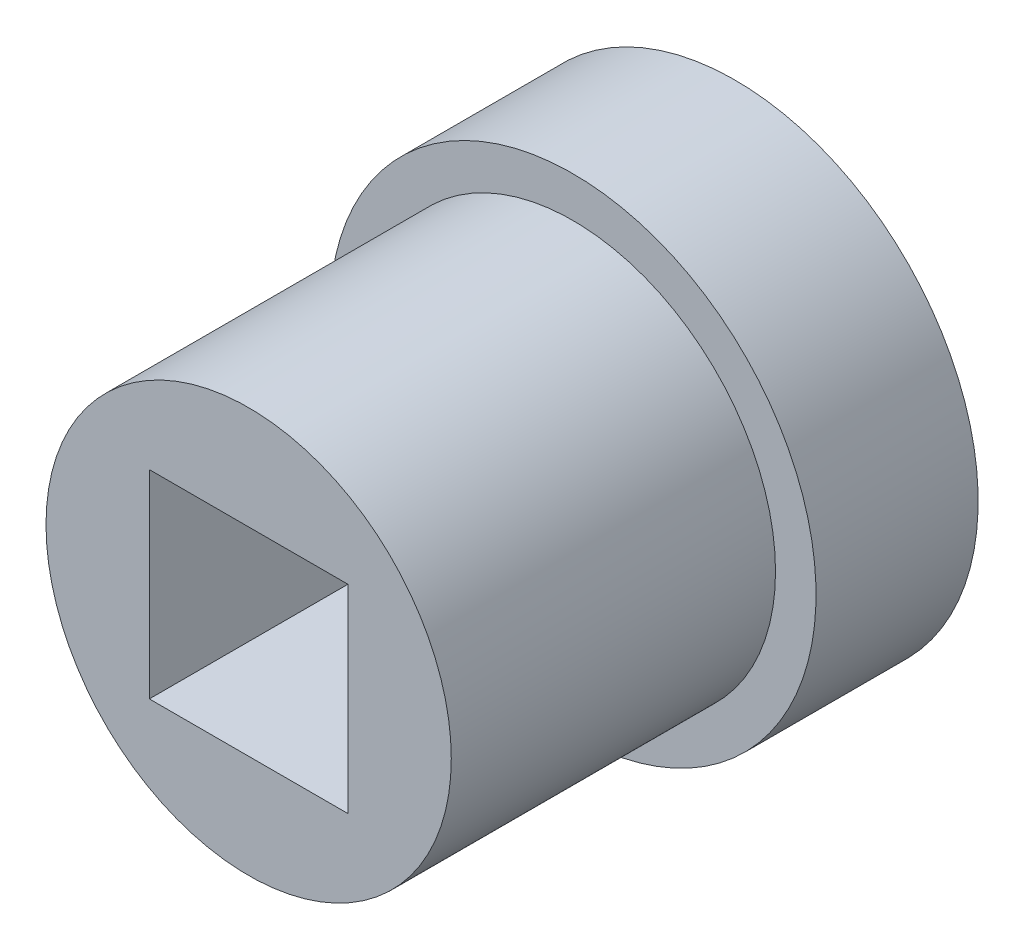
ISO-10303-21;
HEADER;
FILE_DESCRIPTION(('STEP AP214'),'2;1');
FILE_NAME('part.step','',(''),(''),'','','');
FILE_SCHEMA(('AUTOMOTIVE_DESIGN { 1 0 10303 214 1 1 1 1 }'));
ENDSEC;
DATA;
#1=APPLICATION_CONTEXT('core data for automotive mechanical design processes');
#2=APPLICATION_PROTOCOL_DEFINITION('international standard','automotive_design',2000,#1);
#3=PRODUCT_CONTEXT('',#1,'mechanical');
#4=PRODUCT('Part','Part','',(#3));
#5=PRODUCT_RELATED_PRODUCT_CATEGORY('part','',(#4));
#6=PRODUCT_DEFINITION_FORMATION('','',#4);
#7=PRODUCT_DEFINITION_CONTEXT('part definition',#1,'design');
#8=PRODUCT_DEFINITION('design','',#6,#7);
#9=PRODUCT_DEFINITION_SHAPE('','',#8);
#10=(LENGTH_UNIT() NAMED_UNIT(*) SI_UNIT(.MILLI.,.METRE.));
#11=(NAMED_UNIT(*) PLANE_ANGLE_UNIT() SI_UNIT($,.RADIAN.));
#12=(NAMED_UNIT(*) SI_UNIT($,.STERADIAN.) SOLID_ANGLE_UNIT());
#13=UNCERTAINTY_MEASURE_WITH_UNIT(LENGTH_MEASURE(1.E-05),#10,'distance_accuracy_value','');
#14=(GEOMETRIC_REPRESENTATION_CONTEXT(3) GLOBAL_UNCERTAINTY_ASSIGNED_CONTEXT((#13)) GLOBAL_UNIT_ASSIGNED_CONTEXT((#10,
#11,#12)) REPRESENTATION_CONTEXT('',''));
#15=CARTESIAN_POINT('',(0.,0.,0.));
#16=DIRECTION('',(0.,0.,1.));
#17=DIRECTION('',(1.,0.,0.));
#18=AXIS2_PLACEMENT_3D('',#15,#16,#17);
#19=CARTESIAN_POINT('',(0.,0.,10.));
#20=DIRECTION('',(0.,0.,-1.));
#21=DIRECTION('',(-1.,0.,0.));
#22=AXIS2_PLACEMENT_3D('',#19,#20,#21);
#23=CYLINDRICAL_SURFACE('',#22,12.5);
#24=CARTESIAN_POINT('',(0.,0.,10.));
#25=DIRECTION('',(0.,0.,1.));
#26=DIRECTION('',(1.,0.,0.));
#27=AXIS2_PLACEMENT_3D('',#24,#25,#26);
#28=CIRCLE('',#27,12.5);
#29=CARTESIAN_POINT('',(12.5,0.,10.));
#30=VERTEX_POINT('',#29);
#31=EDGE_CURVE('E11',#30,#30,#28,.T.);
#32=ORIENTED_EDGE('',*,*,#31,.F.);
#33=EDGE_LOOP('',(#32));
#34=FACE_BOUND('',#33,.T.);
#35=CARTESIAN_POINT('',(0.,0.,-10.));
#36=DIRECTION('',(0.,0.,1.));
#37=DIRECTION('',(1.,0.,0.));
#38=AXIS2_PLACEMENT_3D('',#35,#36,#37);
#39=CIRCLE('',#38,12.5);
#40=CARTESIAN_POINT('',(12.5,0.,-10.));
#41=VERTEX_POINT('',#40);
#42=EDGE_CURVE('E42',#41,#41,#39,.T.);
#43=ORIENTED_EDGE('',*,*,#42,.T.);
#44=EDGE_LOOP('',(#43));
#45=FACE_BOUND('',#44,.T.);
#46=ADVANCED_FACE('F39',(#34,#45),#23,.T.);
#47=CARTESIAN_POINT('',(0.,0.,10.));
#48=DIRECTION('',(0.,0.,1.));
#49=DIRECTION('',(1.,0.,0.));
#50=AXIS2_PLACEMENT_3D('',#47,#48,#49);
#51=PLANE('',#50);
#52=DIRECTION('',(0.,1.,0.));
#53=VECTOR('',#52,1.);
#54=CARTESIAN_POINT('',(6.125,6.125,10.));
#55=LINE('',#54,#53);
#56=CARTESIAN_POINT('',(6.125,-6.125,10.));
#57=VERTEX_POINT('',#56);
#58=CARTESIAN_POINT('',(6.125,6.125,10.));
#59=VERTEX_POINT('',#58);
#60=EDGE_CURVE('E54',#57,#59,#55,.T.);
#61=ORIENTED_EDGE('',*,*,#60,.F.);
#62=DIRECTION('',(1.,0.,0.));
#63=VECTOR('',#62,1.);
#64=CARTESIAN_POINT('',(-6.125,-6.125,10.));
#65=LINE('',#64,#63);
#66=CARTESIAN_POINT('',(-6.125,-6.125,10.));
#67=VERTEX_POINT('',#66);
#68=EDGE_CURVE('E101',#67,#57,#65,.T.);
#69=ORIENTED_EDGE('',*,*,#68,.F.);
#70=DIRECTION('',(0.,-1.,0.));
#71=VECTOR('',#70,1.);
#72=CARTESIAN_POINT('',(-6.125,6.125,10.));
#73=LINE('',#72,#71);
#74=CARTESIAN_POINT('',(-6.125,6.125,10.));
#75=VERTEX_POINT('',#74);
#76=EDGE_CURVE('E105',#75,#67,#73,.T.);
#77=ORIENTED_EDGE('',*,*,#76,.F.);
#78=DIRECTION('',(-1.,0.,0.));
#79=VECTOR('',#78,1.);
#80=CARTESIAN_POINT('',(-6.125,6.125,10.));
#81=LINE('',#80,#79);
#82=EDGE_CURVE('E117',#59,#75,#81,.T.);
#83=ORIENTED_EDGE('',*,*,#82,.F.);
#84=EDGE_LOOP('',(#61,#69,#77,#83));
#85=FACE_BOUND('',#84,.T.);
#86=ORIENTED_EDGE('',*,*,#31,.T.);
#87=EDGE_LOOP('',(#86));
#88=FACE_BOUND('',#87,.T.);
#89=ADVANCED_FACE('F158',(#85,#88),#51,.T.);
#90=CARTESIAN_POINT('',(0.,0.,-20.));
#91=DIRECTION('',(0.,0.,1.));
#92=DIRECTION('',(1.,0.,0.));
#93=AXIS2_PLACEMENT_3D('',#90,#91,#92);
#94=CYLINDRICAL_SURFACE('',#93,15.);
#95=CARTESIAN_POINT('',(0.,0.,-20.));
#96=DIRECTION('',(0.,0.,-1.));
#97=DIRECTION('',(-1.,0.,0.));
#98=AXIS2_PLACEMENT_3D('',#95,#96,#97);
#99=CIRCLE('',#98,15.);
#100=CARTESIAN_POINT('',(-15.,0.,-20.));
#101=VERTEX_POINT('',#100);
#102=EDGE_CURVE('E133',#101,#101,#99,.T.);
#103=ORIENTED_EDGE('',*,*,#102,.F.);
#104=EDGE_LOOP('',(#103));
#105=FACE_BOUND('',#104,.T.);
#106=CARTESIAN_POINT('',(0.,0.,-10.));
#107=DIRECTION('',(0.,0.,-1.));
#108=DIRECTION('',(-1.,0.,0.));
#109=AXIS2_PLACEMENT_3D('',#106,#107,#108);
#110=CIRCLE('',#109,15.);
#111=CARTESIAN_POINT('',(-15.,0.,-10.));
#112=VERTEX_POINT('',#111);
#113=EDGE_CURVE('E127',#112,#112,#110,.T.);
#114=ORIENTED_EDGE('',*,*,#113,.T.);
#115=EDGE_LOOP('',(#114));
#116=FACE_BOUND('',#115,.T.);
#117=ADVANCED_FACE('F141',(#105,#116),#94,.T.);
#118=CARTESIAN_POINT('',(0.,0.,-20.));
#119=DIRECTION('',(0.,0.,-1.));
#120=DIRECTION('',(-1.,0.,0.));
#121=AXIS2_PLACEMENT_3D('',#118,#119,#120);
#122=PLANE('',#121);
#123=CARTESIAN_POINT('',(-9.38197780542924,7.48187763491286,-20.));
#124=DIRECTION('',(0.,0.,-1.));
#125=DIRECTION('',(-0.623489801858743,-0.781831482468022,0.));
#126=AXIS2_PLACEMENT_3D('',#123,#124,#125);
#127=CIRCLE('',#126,0.999999999999999);
#128=CARTESIAN_POINT('',(-10.005467607288,6.70004615244483,-20.));
#129=VERTEX_POINT('',#128);
#130=EDGE_CURVE('E218',#129,#129,#127,.T.);
#131=ORIENTED_EDGE('',*,*,#130,.F.);
#132=EDGE_LOOP('',(#131));
#133=FACE_BOUND('',#132,.T.);
#134=CARTESIAN_POINT('',(-11.6991349658984,-2.67025121197782,-20.));
#135=DIRECTION('',(0.,0.,-1.));
#136=DIRECTION('',(0.222520933956305,-0.974927912181826,0.));
#137=AXIS2_PLACEMENT_3D('',#134,#135,#136);
#138=CIRCLE('',#137,0.999999999999999);
#139=CARTESIAN_POINT('',(-11.4766140319421,-3.64517912415964,-20.));
#140=VERTEX_POINT('',#139);
#141=EDGE_CURVE('E226',#140,#140,#138,.T.);
#142=ORIENTED_EDGE('',*,*,#141,.F.);
#143=EDGE_LOOP('',(#142));
#144=FACE_BOUND('',#143,.T.);
#145=CARTESIAN_POINT('',(-5.2066048781839,-10.811626433051,-20.));
#146=DIRECTION('',(0.,0.,-1.));
#147=DIRECTION('',(0.900968867902416,-0.433883739117565,0.));
#148=AXIS2_PLACEMENT_3D('',#145,#146,#147);
#149=CIRCLE('',#148,0.999999999999999);
#150=CARTESIAN_POINT('',(-4.30563601028148,-11.2455101721686,-20.));
#151=VERTEX_POINT('',#150);
#152=EDGE_CURVE('E234',#151,#151,#149,.T.);
#153=ORIENTED_EDGE('',*,*,#152,.F.);
#154=EDGE_LOOP('',(#153));
#155=FACE_BOUND('',#154,.T.);
#156=CARTESIAN_POINT('',(5.20660487818725,-10.8116264330494,-20.));
#157=DIRECTION('',(0.,0.,-1.));
#158=DIRECTION('',(0.900968867902422,0.433883739117553,0.));
#159=AXIS2_PLACEMENT_3D('',#156,#157,#158);
#160=CIRCLE('',#159,0.999999999999999);
#161=CARTESIAN_POINT('',(6.10757374608967,-10.3777426939319,-20.));
#162=VERTEX_POINT('',#161);
#163=EDGE_CURVE('E242',#162,#162,#160,.T.);
#164=ORIENTED_EDGE('',*,*,#163,.F.);
#165=EDGE_LOOP('',(#164));
#166=FACE_BOUND('',#165,.T.);
#167=CARTESIAN_POINT('',(11.6991349658992,-2.67025121197419,-20.));
#168=DIRECTION('',(0.,0.,-1.));
#169=DIRECTION('',(0.222520933956318,0.974927912181823,0.));
#170=AXIS2_PLACEMENT_3D('',#167,#168,#169);
#171=CIRCLE('',#170,0.999999999999999);
#172=CARTESIAN_POINT('',(11.9216558998556,-1.69532329979237,-20.));
#173=VERTEX_POINT('',#172);
#174=EDGE_CURVE('E250',#173,#173,#171,.T.);
#175=ORIENTED_EDGE('',*,*,#174,.F.);
#176=EDGE_LOOP('',(#175));
#177=FACE_BOUND('',#176,.T.);
#178=CARTESIAN_POINT('',(9.38197780542692,7.48187763491576,-20.));
#179=DIRECTION('',(0.,0.,-1.));
#180=DIRECTION('',(-0.623489801858732,0.781831482468031,0.));
#181=AXIS2_PLACEMENT_3D('',#178,#179,#180);
#182=CIRCLE('',#181,0.999999999999999);
#183=CARTESIAN_POINT('',(8.75848800356819,8.26370911738379,-20.));
#184=VERTEX_POINT('',#183);
#185=EDGE_CURVE('E209',#184,#184,#182,.T.);
#186=ORIENTED_EDGE('',*,*,#185,.F.);
#187=EDGE_LOOP('',(#186));
#188=FACE_BOUND('',#187,.T.);
#189=CARTESIAN_POINT('',(-1.94289029309402E-12,12.000000020224,-20.));
#190=DIRECTION('',(0.,0.,-1.));
#191=DIRECTION('',(-1.,0.,0.));
#192=AXIS2_PLACEMENT_3D('',#189,#190,#191);
#193=CIRCLE('',#192,0.999999999999999);
#194=CARTESIAN_POINT('',(-1.00000000000194,12.000000020224,-20.));
#195=VERTEX_POINT('',#194);
#196=EDGE_CURVE('E108',#195,#195,#193,.T.);
#197=ORIENTED_EDGE('',*,*,#196,.F.);
#198=EDGE_LOOP('',(#197));
#199=FACE_BOUND('',#198,.T.);
#200=DIRECTION('',(0.,1.,0.));
#201=VECTOR('',#200,1.);
#202=CARTESIAN_POINT('',(6.125,6.125,-20.));
#203=LINE('',#202,#201);
#204=CARTESIAN_POINT('',(6.125,-6.125,-20.));
#205=VERTEX_POINT('',#204);
#206=CARTESIAN_POINT('',(6.125,6.125,-20.));
#207=VERTEX_POINT('',#206);
#208=EDGE_CURVE('E82',#205,#207,#203,.T.);
#209=ORIENTED_EDGE('',*,*,#208,.T.);
#210=DIRECTION('',(-1.,0.,0.));
#211=VECTOR('',#210,1.);
#212=CARTESIAN_POINT('',(-6.125,6.125,-20.));
#213=LINE('',#212,#211);
#214=CARTESIAN_POINT('',(-6.125,6.125,-20.));
#215=VERTEX_POINT('',#214);
#216=EDGE_CURVE('E92',#207,#215,#213,.T.);
#217=ORIENTED_EDGE('',*,*,#216,.T.);
#218=DIRECTION('',(0.,-1.,0.));
#219=VECTOR('',#218,1.);
#220=CARTESIAN_POINT('',(-6.125,6.125,-20.));
#221=LINE('',#220,#219);
#222=CARTESIAN_POINT('',(-6.125,-6.125,-20.));
#223=VERTEX_POINT('',#222);
#224=EDGE_CURVE('E62',#215,#223,#221,.T.);
#225=ORIENTED_EDGE('',*,*,#224,.T.);
#226=DIRECTION('',(1.,0.,0.));
#227=VECTOR('',#226,1.);
#228=CARTESIAN_POINT('',(-6.125,-6.125,-20.));
#229=LINE('',#228,#227);
#230=EDGE_CURVE('E89',#223,#205,#229,.T.);
#231=ORIENTED_EDGE('',*,*,#230,.T.);
#232=EDGE_LOOP('',(#209,#217,#225,#231));
#233=FACE_BOUND('',#232,.T.);
#234=ORIENTED_EDGE('',*,*,#102,.T.);
#235=EDGE_LOOP('',(#234));
#236=FACE_BOUND('',#235,.T.);
#237=ADVANCED_FACE('F97',(#133,#144,#155,#166,#177,#188,#199,#233,#236),#122,.T.);
#238=CARTESIAN_POINT('',(0.,0.,-10.));
#239=DIRECTION('',(0.,0.,-1.));
#240=DIRECTION('',(-1.,0.,0.));
#241=AXIS2_PLACEMENT_3D('',#238,#239,#240);
#242=PLANE('',#241);
#243=ORIENTED_EDGE('',*,*,#42,.F.);
#244=EDGE_LOOP('',(#243));
#245=FACE_BOUND('',#244,.T.);
#246=ORIENTED_EDGE('',*,*,#113,.F.);
#247=EDGE_LOOP('',(#246));
#248=FACE_BOUND('',#247,.T.);
#249=ADVANCED_FACE('F143',(#245,#248),#242,.F.);
#250=CARTESIAN_POINT('',(6.125,6.125,-20.));
#251=DIRECTION('',(1.,0.,0.));
#252=DIRECTION('',(0.,1.,0.));
#253=AXIS2_PLACEMENT_3D('',#250,#251,#252);
#254=PLANE('',#253);
#255=ORIENTED_EDGE('',*,*,#60,.T.);
#256=DIRECTION('',(0.,0.,1.));
#257=VECTOR('',#256,1.);
#258=CARTESIAN_POINT('',(6.125,6.125,-20.));
#259=LINE('',#258,#257);
#260=EDGE_CURVE('E78',#207,#59,#259,.T.);
#261=ORIENTED_EDGE('',*,*,#260,.F.);
#262=ORIENTED_EDGE('',*,*,#208,.F.);
#263=DIRECTION('',(0.,0.,1.));
#264=VECTOR('',#263,1.);
#265=CARTESIAN_POINT('',(6.125,-6.125,-20.));
#266=LINE('',#265,#264);
#267=EDGE_CURVE('E124',#205,#57,#266,.T.);
#268=ORIENTED_EDGE('',*,*,#267,.T.);
#269=EDGE_LOOP('',(#255,#261,#262,#268));
#270=FACE_BOUND('',#269,.T.);
#271=ADVANCED_FACE('F80',(#270),#254,.F.);
#272=CARTESIAN_POINT('',(-6.125,-6.125,-20.));
#273=DIRECTION('',(0.,-1.,0.));
#274=DIRECTION('',(0.,0.,-1.));
#275=AXIS2_PLACEMENT_3D('',#272,#273,#274);
#276=PLANE('',#275);
#277=ORIENTED_EDGE('',*,*,#68,.T.);
#278=ORIENTED_EDGE('',*,*,#267,.F.);
#279=ORIENTED_EDGE('',*,*,#230,.F.);
#280=DIRECTION('',(0.,0.,1.));
#281=VECTOR('',#280,1.);
#282=CARTESIAN_POINT('',(-6.125,-6.125,-20.));
#283=LINE('',#282,#281);
#284=EDGE_CURVE('E128',#223,#67,#283,.T.);
#285=ORIENTED_EDGE('',*,*,#284,.T.);
#286=EDGE_LOOP('',(#277,#278,#279,#285));
#287=FACE_BOUND('',#286,.T.);
#288=ADVANCED_FACE('F151',(#287),#276,.F.);
#289=CARTESIAN_POINT('',(-6.125,6.125,-20.));
#290=DIRECTION('',(-1.,0.,0.));
#291=DIRECTION('',(0.,-1.,0.));
#292=AXIS2_PLACEMENT_3D('',#289,#290,#291);
#293=PLANE('',#292);
#294=ORIENTED_EDGE('',*,*,#76,.T.);
#295=ORIENTED_EDGE('',*,*,#284,.F.);
#296=ORIENTED_EDGE('',*,*,#224,.F.);
#297=DIRECTION('',(0.,0.,1.));
#298=VECTOR('',#297,1.);
#299=CARTESIAN_POINT('',(-6.125,6.125,-20.));
#300=LINE('',#299,#298);
#301=EDGE_CURVE('E88',#215,#75,#300,.T.);
#302=ORIENTED_EDGE('',*,*,#301,.T.);
#303=EDGE_LOOP('',(#294,#295,#296,#302));
#304=FACE_BOUND('',#303,.T.);
#305=ADVANCED_FACE('F175',(#304),#293,.F.);
#306=CARTESIAN_POINT('',(-6.125,6.125,-20.));
#307=DIRECTION('',(0.,1.,0.));
#308=DIRECTION('',(0.,0.,1.));
#309=AXIS2_PLACEMENT_3D('',#306,#307,#308);
#310=PLANE('',#309);
#311=ORIENTED_EDGE('',*,*,#82,.T.);
#312=ORIENTED_EDGE('',*,*,#301,.F.);
#313=ORIENTED_EDGE('',*,*,#216,.F.);
#314=ORIENTED_EDGE('',*,*,#260,.T.);
#315=EDGE_LOOP('',(#311,#312,#313,#314));
#316=FACE_BOUND('',#315,.T.);
#317=ADVANCED_FACE('F93',(#316),#310,.F.);
#318=CARTESIAN_POINT('',(-1.94289029309402E-12,12.000000020224,-15.));
#319=DIRECTION('',(0.,0.,-1.));
#320=DIRECTION('',(-1.,0.,0.));
#321=AXIS2_PLACEMENT_3D('',#318,#319,#320);
#322=CYLINDRICAL_SURFACE('',#321,0.999999999999999);
#323=CARTESIAN_POINT('',(-1.94289029309402E-12,12.000000020224,-15.));
#324=DIRECTION('',(0.,0.,-1.));
#325=DIRECTION('',(-1.,0.,0.));
#326=AXIS2_PLACEMENT_3D('',#323,#324,#325);
#327=CIRCLE('',#326,0.999999999999999);
#328=CARTESIAN_POINT('',(-1.00000000000194,12.000000020224,-15.));
#329=VERTEX_POINT('',#328);
#330=EDGE_CURVE('E118',#329,#329,#327,.T.);
#331=ORIENTED_EDGE('',*,*,#330,.F.);
#332=EDGE_LOOP('',(#331));
#333=FACE_BOUND('',#332,.T.);
#334=ORIENTED_EDGE('',*,*,#196,.T.);
#335=EDGE_LOOP('',(#334));
#336=FACE_BOUND('',#335,.T.);
#337=ADVANCED_FACE('F184',(#333,#336),#322,.F.);
#338=CARTESIAN_POINT('',(-1.94289029309402E-12,12.000000020224,-15.));
#339=DIRECTION('',(0.,0.,-1.));
#340=DIRECTION('',(-1.,0.,0.));
#341=AXIS2_PLACEMENT_3D('',#338,#339,#340);
#342=PLANE('',#341);
#343=ORIENTED_EDGE('',*,*,#330,.T.);
#344=EDGE_LOOP('',(#343));
#345=FACE_BOUND('',#344,.T.);
#346=ADVANCED_FACE('F191',(#345),#342,.T.);
#347=CARTESIAN_POINT('',(9.38197780542692,7.48187763491576,-15.));
#348=DIRECTION('',(0.,0.,-1.));
#349=DIRECTION('',(-1.,0.,0.));
#350=AXIS2_PLACEMENT_3D('',#347,#348,#349);
#351=CYLINDRICAL_SURFACE('',#350,0.999999999999999);
#352=CARTESIAN_POINT('',(9.38197780542692,7.48187763491576,-15.));
#353=DIRECTION('',(0.,0.,-1.));
#354=DIRECTION('',(-0.623489801858732,0.781831482468031,0.));
#355=AXIS2_PLACEMENT_3D('',#352,#353,#354);
#356=CIRCLE('',#355,0.999999999999999);
#357=CARTESIAN_POINT('',(8.75848800356819,8.26370911738379,-15.));
#358=VERTEX_POINT('',#357);
#359=EDGE_CURVE('E205',#358,#358,#356,.T.);
#360=ORIENTED_EDGE('',*,*,#359,.F.);
#361=EDGE_LOOP('',(#360));
#362=FACE_BOUND('',#361,.T.);
#363=ORIENTED_EDGE('',*,*,#185,.T.);
#364=EDGE_LOOP('',(#363));
#365=FACE_BOUND('',#364,.T.);
#366=ADVANCED_FACE('F196',(#362,#365),#351,.F.);
#367=CARTESIAN_POINT('',(9.38197780542692,7.48187763491576,-15.));
#368=DIRECTION('',(0.,0.,-1.));
#369=DIRECTION('',(-0.623489801858732,0.781831482468031,0.));
#370=AXIS2_PLACEMENT_3D('',#367,#368,#369);
#371=PLANE('',#370);
#372=ORIENTED_EDGE('',*,*,#359,.T.);
#373=EDGE_LOOP('',(#372));
#374=FACE_BOUND('',#373,.T.);
#375=ADVANCED_FACE('F263',(#374),#371,.T.);
#376=CARTESIAN_POINT('',(11.6991349658992,-2.67025121197419,-15.));
#377=DIRECTION('',(0.,0.,-1.));
#378=DIRECTION('',(-1.,0.,0.));
#379=AXIS2_PLACEMENT_3D('',#376,#377,#378);
#380=CYLINDRICAL_SURFACE('',#379,0.999999999999999);
#381=CARTESIAN_POINT('',(11.6991349658992,-2.67025121197419,-15.));
#382=DIRECTION('',(0.,0.,-1.));
#383=DIRECTION('',(0.222520933956318,0.974927912181823,0.));
#384=AXIS2_PLACEMENT_3D('',#381,#382,#383);
#385=CIRCLE('',#384,0.999999999999999);
#386=CARTESIAN_POINT('',(11.9216558998556,-1.69532329979237,-15.));
#387=VERTEX_POINT('',#386);
#388=EDGE_CURVE('E215',#387,#387,#385,.T.);
#389=ORIENTED_EDGE('',*,*,#388,.F.);
#390=EDGE_LOOP('',(#389));
#391=FACE_BOUND('',#390,.T.);
#392=ORIENTED_EDGE('',*,*,#174,.T.);
#393=EDGE_LOOP('',(#392));
#394=FACE_BOUND('',#393,.T.);
#395=ADVANCED_FACE('F260',(#391,#394),#380,.F.);
#396=CARTESIAN_POINT('',(11.6991349658992,-2.67025121197419,-15.));
#397=DIRECTION('',(0.,0.,-1.));
#398=DIRECTION('',(0.222520933956318,0.974927912181823,0.));
#399=AXIS2_PLACEMENT_3D('',#396,#397,#398);
#400=PLANE('',#399);
#401=ORIENTED_EDGE('',*,*,#388,.T.);
#402=EDGE_LOOP('',(#401));
#403=FACE_BOUND('',#402,.T.);
#404=ADVANCED_FACE('F258',(#403),#400,.T.);
#405=CARTESIAN_POINT('',(5.20660487818725,-10.8116264330494,-15.));
#406=DIRECTION('',(0.,0.,-1.));
#407=DIRECTION('',(-1.,0.,0.));
#408=AXIS2_PLACEMENT_3D('',#405,#406,#407);
#409=CYLINDRICAL_SURFACE('',#408,0.999999999999999);
#410=CARTESIAN_POINT('',(5.20660487818725,-10.8116264330494,-15.));
#411=DIRECTION('',(0.,0.,-1.));
#412=DIRECTION('',(0.900968867902422,0.433883739117553,0.));
#413=AXIS2_PLACEMENT_3D('',#410,#411,#412);
#414=CIRCLE('',#413,0.999999999999999);
#415=CARTESIAN_POINT('',(6.10757374608967,-10.3777426939319,-15.));
#416=VERTEX_POINT('',#415);
#417=EDGE_CURVE('E246',#416,#416,#414,.T.);
#418=ORIENTED_EDGE('',*,*,#417,.F.);
#419=EDGE_LOOP('',(#418));
#420=FACE_BOUND('',#419,.T.);
#421=ORIENTED_EDGE('',*,*,#163,.T.);
#422=EDGE_LOOP('',(#421));
#423=FACE_BOUND('',#422,.T.);
#424=ADVANCED_FACE('F303',(#420,#423),#409,.F.);
#425=CARTESIAN_POINT('',(5.20660487818725,-10.8116264330494,-15.));
#426=DIRECTION('',(0.,0.,-1.));
#427=DIRECTION('',(0.900968867902422,0.433883739117553,0.));
#428=AXIS2_PLACEMENT_3D('',#425,#426,#427);
#429=PLANE('',#428);
#430=ORIENTED_EDGE('',*,*,#417,.T.);
#431=EDGE_LOOP('',(#430));
#432=FACE_BOUND('',#431,.T.);
#433=ADVANCED_FACE('F298',(#432),#429,.T.);
#434=CARTESIAN_POINT('',(-5.2066048781839,-10.811626433051,-15.));
#435=DIRECTION('',(0.,0.,-1.));
#436=DIRECTION('',(-1.,0.,0.));
#437=AXIS2_PLACEMENT_3D('',#434,#435,#436);
#438=CYLINDRICAL_SURFACE('',#437,0.999999999999999);
#439=CARTESIAN_POINT('',(-5.2066048781839,-10.811626433051,-15.));
#440=DIRECTION('',(0.,0.,-1.));
#441=DIRECTION('',(0.900968867902416,-0.433883739117565,0.));
#442=AXIS2_PLACEMENT_3D('',#439,#440,#441);
#443=CIRCLE('',#442,0.999999999999999);
#444=CARTESIAN_POINT('',(-4.30563601028148,-11.2455101721686,-15.));
#445=VERTEX_POINT('',#444);
#446=EDGE_CURVE('E238',#445,#445,#443,.T.);
#447=ORIENTED_EDGE('',*,*,#446,.F.);
#448=EDGE_LOOP('',(#447));
#449=FACE_BOUND('',#448,.T.);
#450=ORIENTED_EDGE('',*,*,#152,.T.);
#451=EDGE_LOOP('',(#450));
#452=FACE_BOUND('',#451,.T.);
#453=ADVANCED_FACE('F295',(#449,#452),#438,.F.);
#454=CARTESIAN_POINT('',(-5.2066048781839,-10.811626433051,-15.));
#455=DIRECTION('',(0.,0.,-1.));
#456=DIRECTION('',(0.900968867902416,-0.433883739117565,0.));
#457=AXIS2_PLACEMENT_3D('',#454,#455,#456);
#458=PLANE('',#457);
#459=ORIENTED_EDGE('',*,*,#446,.T.);
#460=EDGE_LOOP('',(#459));
#461=FACE_BOUND('',#460,.T.);
#462=ADVANCED_FACE('F290',(#461),#458,.T.);
#463=CARTESIAN_POINT('',(-11.6991349658984,-2.67025121197782,-15.));
#464=DIRECTION('',(0.,0.,-1.));
#465=DIRECTION('',(-1.,0.,0.));
#466=AXIS2_PLACEMENT_3D('',#463,#464,#465);
#467=CYLINDRICAL_SURFACE('',#466,0.999999999999999);
#468=CARTESIAN_POINT('',(-11.6991349658984,-2.67025121197782,-15.));
#469=DIRECTION('',(0.,0.,-1.));
#470=DIRECTION('',(0.222520933956305,-0.974927912181826,0.));
#471=AXIS2_PLACEMENT_3D('',#468,#469,#470);
#472=CIRCLE('',#471,0.999999999999999);
#473=CARTESIAN_POINT('',(-11.4766140319421,-3.64517912415964,-15.));
#474=VERTEX_POINT('',#473);
#475=EDGE_CURVE('E230',#474,#474,#472,.T.);
#476=ORIENTED_EDGE('',*,*,#475,.F.);
#477=EDGE_LOOP('',(#476));
#478=FACE_BOUND('',#477,.T.);
#479=ORIENTED_EDGE('',*,*,#141,.T.);
#480=EDGE_LOOP('',(#479));
#481=FACE_BOUND('',#480,.T.);
#482=ADVANCED_FACE('F287',(#478,#481),#467,.F.);
#483=CARTESIAN_POINT('',(-11.6991349658984,-2.67025121197782,-15.));
#484=DIRECTION('',(0.,0.,-1.));
#485=DIRECTION('',(0.222520933956305,-0.974927912181826,0.));
#486=AXIS2_PLACEMENT_3D('',#483,#484,#485);
#487=PLANE('',#486);
#488=ORIENTED_EDGE('',*,*,#475,.T.);
#489=EDGE_LOOP('',(#488));
#490=FACE_BOUND('',#489,.T.);
#491=ADVANCED_FACE('F282',(#490),#487,.T.);
#492=CARTESIAN_POINT('',(-9.38197780542924,7.48187763491286,-15.));
#493=DIRECTION('',(0.,0.,-1.));
#494=DIRECTION('',(-1.,0.,0.));
#495=AXIS2_PLACEMENT_3D('',#492,#493,#494);
#496=CYLINDRICAL_SURFACE('',#495,0.999999999999999);
#497=CARTESIAN_POINT('',(-9.38197780542924,7.48187763491286,-15.));
#498=DIRECTION('',(0.,0.,-1.));
#499=DIRECTION('',(-0.623489801858743,-0.781831482468022,0.));
#500=AXIS2_PLACEMENT_3D('',#497,#498,#499);
#501=CIRCLE('',#500,0.999999999999999);
#502=CARTESIAN_POINT('',(-10.005467607288,6.70004615244483,-15.));
#503=VERTEX_POINT('',#502);
#504=EDGE_CURVE('E222',#503,#503,#501,.T.);
#505=ORIENTED_EDGE('',*,*,#504,.F.);
#506=EDGE_LOOP('',(#505));
#507=FACE_BOUND('',#506,.T.);
#508=ORIENTED_EDGE('',*,*,#130,.T.);
#509=EDGE_LOOP('',(#508));
#510=FACE_BOUND('',#509,.T.);
#511=ADVANCED_FACE('F278',(#507,#510),#496,.F.);
#512=CARTESIAN_POINT('',(-9.38197780542924,7.48187763491286,-15.));
#513=DIRECTION('',(0.,0.,-1.));
#514=DIRECTION('',(-0.623489801858743,-0.781831482468022,0.));
#515=AXIS2_PLACEMENT_3D('',#512,#513,#514);
#516=PLANE('',#515);
#517=ORIENTED_EDGE('',*,*,#504,.T.);
#518=EDGE_LOOP('',(#517));
#519=FACE_BOUND('',#518,.T.);
#520=ADVANCED_FACE('F281',(#519),#516,.T.);
#521=CLOSED_SHELL('',(#46,#89,#117,#237,#249,#271,#288,#305,#317,#337,#346,#366,#375,#395,#404,
#424,#433,#453,#462,#482,#491,#511,#520));
#522=MANIFOLD_SOLID_BREP('B2',#521);
#523=ADVANCED_BREP_SHAPE_REPRESENTATION('',(#18,#522),#14);
#524=SHAPE_DEFINITION_REPRESENTATION(#9,#523);
ENDSEC;
END-ISO-10303-21;
